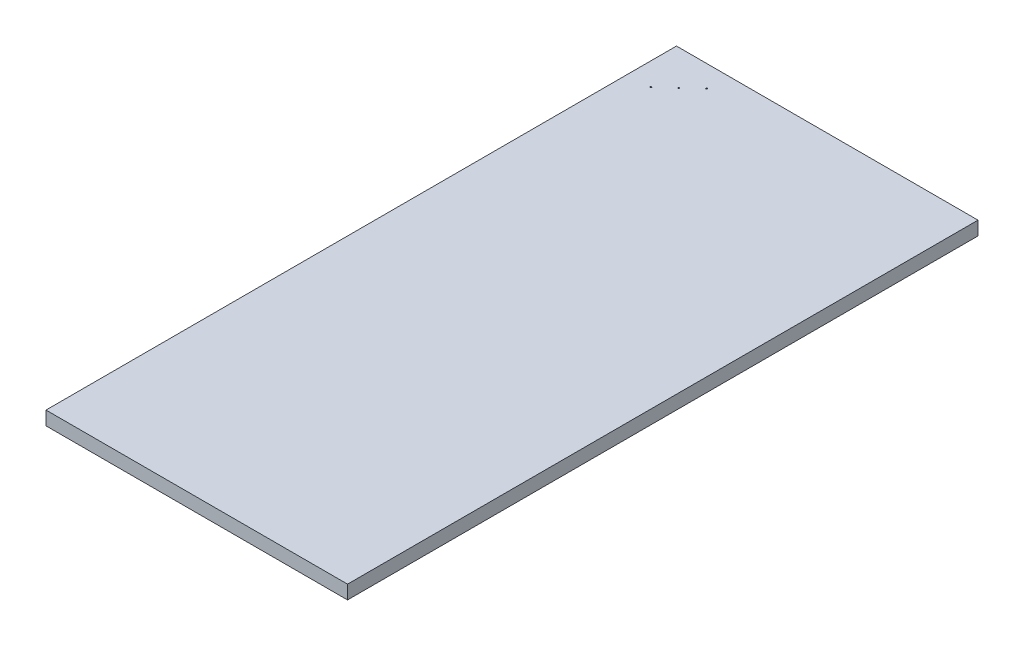
ISO-10303-21;
HEADER;
FILE_DESCRIPTION(('STEP AP214'),'2;1');
FILE_NAME('part.step','',(''),(''),'','','');
FILE_SCHEMA(('AUTOMOTIVE_DESIGN { 1 0 10303 214 1 1 1 1 }'));
ENDSEC;
DATA;
#1=APPLICATION_CONTEXT('core data for automotive mechanical design processes');
#2=APPLICATION_PROTOCOL_DEFINITION('international standard','automotive_design',2000,#1);
#3=PRODUCT_CONTEXT('',#1,'mechanical');
#4=PRODUCT('Part','Part','',(#3));
#5=PRODUCT_RELATED_PRODUCT_CATEGORY('part','',(#4));
#6=PRODUCT_DEFINITION_FORMATION('','',#4);
#7=PRODUCT_DEFINITION_CONTEXT('part definition',#1,'design');
#8=PRODUCT_DEFINITION('design','',#6,#7);
#9=PRODUCT_DEFINITION_SHAPE('','',#8);
#10=(LENGTH_UNIT() NAMED_UNIT(*) SI_UNIT(.MILLI.,.METRE.));
#11=(NAMED_UNIT(*) PLANE_ANGLE_UNIT() SI_UNIT($,.RADIAN.));
#12=(NAMED_UNIT(*) SI_UNIT($,.STERADIAN.) SOLID_ANGLE_UNIT());
#13=UNCERTAINTY_MEASURE_WITH_UNIT(LENGTH_MEASURE(1.E-05),#10,'distance_accuracy_value','');
#14=(GEOMETRIC_REPRESENTATION_CONTEXT(3) GLOBAL_UNCERTAINTY_ASSIGNED_CONTEXT((#13)) GLOBAL_UNIT_ASSIGNED_CONTEXT((#10,
#11,#12)) REPRESENTATION_CONTEXT('',''));
#15=CARTESIAN_POINT('',(0.,0.,0.));
#16=DIRECTION('',(0.,0.,1.));
#17=DIRECTION('',(1.,0.,0.));
#18=AXIS2_PLACEMENT_3D('',#15,#16,#17);
#19=CARTESIAN_POINT('',(139.7,12.7,0.));
#20=DIRECTION('',(1.,0.,0.));
#21=DIRECTION('',(0.,0.,-1.));
#22=AXIS2_PLACEMENT_3D('',#19,#20,#21);
#23=PLANE('',#22);
#24=DIRECTION('',(0.,0.,1.));
#25=VECTOR('',#24,1.);
#26=CARTESIAN_POINT('',(139.7,0.,0.));
#27=LINE('',#26,#25);
#28=CARTESIAN_POINT('',(139.7,0.,-292.1));
#29=VERTEX_POINT('',#28);
#30=CARTESIAN_POINT('',(139.7,0.,292.1));
#31=VERTEX_POINT('',#30);
#32=EDGE_CURVE('E105',#29,#31,#27,.T.);
#33=ORIENTED_EDGE('',*,*,#32,.F.);
#34=DIRECTION('',(0.,-1.,0.));
#35=VECTOR('',#34,1.);
#36=CARTESIAN_POINT('',(139.7,12.7,-292.1));
#37=LINE('',#36,#35);
#38=CARTESIAN_POINT('',(139.7,12.7,-292.1));
#39=VERTEX_POINT('',#38);
#40=EDGE_CURVE('E11',#39,#29,#37,.T.);
#41=ORIENTED_EDGE('',*,*,#40,.F.);
#42=DIRECTION('',(0.,0.,1.));
#43=VECTOR('',#42,1.);
#44=CARTESIAN_POINT('',(139.7,12.7,0.));
#45=LINE('',#44,#43);
#46=CARTESIAN_POINT('',(139.7,12.7,292.1));
#47=VERTEX_POINT('',#46);
#48=EDGE_CURVE('E98',#39,#47,#45,.T.);
#49=ORIENTED_EDGE('',*,*,#48,.T.);
#50=DIRECTION('',(0.,-1.,0.));
#51=VECTOR('',#50,1.);
#52=CARTESIAN_POINT('',(139.7,12.7,292.1));
#53=LINE('',#52,#51);
#54=EDGE_CURVE('E79',#47,#31,#53,.T.);
#55=ORIENTED_EDGE('',*,*,#54,.T.);
#56=EDGE_LOOP('',(#33,#41,#49,#55));
#57=FACE_BOUND('',#56,.T.);
#58=ADVANCED_FACE('F41',(#57),#23,.T.);
#59=CARTESIAN_POINT('',(0.,12.7,-292.1));
#60=DIRECTION('',(0.,0.,-1.));
#61=DIRECTION('',(-1.,0.,0.));
#62=AXIS2_PLACEMENT_3D('',#59,#60,#61);
#63=PLANE('',#62);
#64=DIRECTION('',(1.,0.,0.));
#65=VECTOR('',#64,1.);
#66=CARTESIAN_POINT('',(0.,0.,-292.1));
#67=LINE('',#66,#65);
#68=CARTESIAN_POINT('',(-139.7,0.,-292.1));
#69=VERTEX_POINT('',#68);
#70=EDGE_CURVE('E92',#69,#29,#67,.T.);
#71=ORIENTED_EDGE('',*,*,#70,.F.);
#72=DIRECTION('',(0.,-1.,0.));
#73=VECTOR('',#72,1.);
#74=CARTESIAN_POINT('',(-139.7,12.7,-292.1));
#75=LINE('',#74,#73);
#76=CARTESIAN_POINT('',(-139.7,12.7,-292.1));
#77=VERTEX_POINT('',#76);
#78=EDGE_CURVE('E49',#77,#69,#75,.T.);
#79=ORIENTED_EDGE('',*,*,#78,.F.);
#80=DIRECTION('',(1.,0.,0.));
#81=VECTOR('',#80,1.);
#82=CARTESIAN_POINT('',(0.,12.7,-292.1));
#83=LINE('',#82,#81);
#84=EDGE_CURVE('E90',#77,#39,#83,.T.);
#85=ORIENTED_EDGE('',*,*,#84,.T.);
#86=ORIENTED_EDGE('',*,*,#40,.T.);
#87=EDGE_LOOP('',(#71,#79,#85,#86));
#88=FACE_BOUND('',#87,.T.);
#89=ADVANCED_FACE('F88',(#88),#63,.T.);
#90=CARTESIAN_POINT('',(-139.7,12.7,0.));
#91=DIRECTION('',(1.,0.,0.));
#92=DIRECTION('',(0.,0.,-1.));
#93=AXIS2_PLACEMENT_3D('',#90,#91,#92);
#94=PLANE('',#93);
#95=DIRECTION('',(0.,0.,1.));
#96=VECTOR('',#95,1.);
#97=CARTESIAN_POINT('',(-139.7,0.,0.));
#98=LINE('',#97,#96);
#99=CARTESIAN_POINT('',(-139.7,0.,292.1));
#100=VERTEX_POINT('',#99);
#101=EDGE_CURVE('E72',#69,#100,#98,.T.);
#102=ORIENTED_EDGE('',*,*,#101,.T.);
#103=DIRECTION('',(0.,-1.,0.));
#104=VECTOR('',#103,1.);
#105=CARTESIAN_POINT('',(-139.7,12.7,292.1));
#106=LINE('',#105,#104);
#107=CARTESIAN_POINT('',(-139.7,12.7,292.1));
#108=VERTEX_POINT('',#107);
#109=EDGE_CURVE('E93',#108,#100,#106,.T.);
#110=ORIENTED_EDGE('',*,*,#109,.F.);
#111=DIRECTION('',(0.,0.,1.));
#112=VECTOR('',#111,1.);
#113=CARTESIAN_POINT('',(-139.7,12.7,0.));
#114=LINE('',#113,#112);
#115=EDGE_CURVE('E94',#77,#108,#114,.T.);
#116=ORIENTED_EDGE('',*,*,#115,.F.);
#117=ORIENTED_EDGE('',*,*,#78,.T.);
#118=EDGE_LOOP('',(#102,#110,#116,#117));
#119=FACE_BOUND('',#118,.T.);
#120=ADVANCED_FACE('F95',(#119),#94,.F.);
#121=CARTESIAN_POINT('',(0.,12.7,292.1));
#122=DIRECTION('',(0.,0.,-1.));
#123=DIRECTION('',(-1.,0.,0.));
#124=AXIS2_PLACEMENT_3D('',#121,#122,#123);
#125=PLANE('',#124);
#126=DIRECTION('',(1.,0.,0.));
#127=VECTOR('',#126,1.);
#128=CARTESIAN_POINT('',(0.,0.,292.1));
#129=LINE('',#128,#127);
#130=EDGE_CURVE('E100',#100,#31,#129,.T.);
#131=ORIENTED_EDGE('',*,*,#130,.T.);
#132=ORIENTED_EDGE('',*,*,#54,.F.);
#133=DIRECTION('',(1.,0.,0.));
#134=VECTOR('',#133,1.);
#135=CARTESIAN_POINT('',(0.,12.7,292.1));
#136=LINE('',#135,#134);
#137=EDGE_CURVE('E57',#108,#47,#136,.T.);
#138=ORIENTED_EDGE('',*,*,#137,.F.);
#139=ORIENTED_EDGE('',*,*,#109,.T.);
#140=EDGE_LOOP('',(#131,#132,#138,#139));
#141=FACE_BOUND('',#140,.T.);
#142=ADVANCED_FACE('F115',(#141),#125,.F.);
#143=CARTESIAN_POINT('',(0.,12.7,0.));
#144=DIRECTION('',(0.,1.,0.));
#145=DIRECTION('',(0.,0.,1.));
#146=AXIS2_PLACEMENT_3D('',#143,#144,#145);
#147=PLANE('',#146);
#148=CARTESIAN_POINT('',(-118.589799828785,12.7,-247.27711409136));
#149=DIRECTION('',(0.,1.,0.));
#150=DIRECTION('',(0.,0.,1.));
#151=AXIS2_PLACEMENT_3D('',#148,#149,#150);
#152=CIRCLE('',#151,0.634999999999985);
#153=CARTESIAN_POINT('',(-118.589799828785,12.7,-246.64211409136));
#154=VERTEX_POINT('',#153);
#155=EDGE_CURVE('E108',#154,#154,#152,.T.);
#156=ORIENTED_EDGE('',*,*,#155,.F.);
#157=EDGE_LOOP('',(#156));
#158=FACE_BOUND('',#157,.T.);
#159=CARTESIAN_POINT('',(-105.02854599514,12.7,-259.508833235432));
#160=DIRECTION('',(0.,1.,0.));
#161=DIRECTION('',(0.,0.,1.));
#162=AXIS2_PLACEMENT_3D('',#159,#160,#161);
#163=CIRCLE('',#162,0.634999999999999);
#164=CARTESIAN_POINT('',(-105.02854599514,12.7,-258.873833235432));
#165=VERTEX_POINT('',#164);
#166=EDGE_CURVE('E161',#165,#165,#163,.T.);
#167=ORIENTED_EDGE('',*,*,#166,.F.);
#168=EDGE_LOOP('',(#167));
#169=FACE_BOUND('',#168,.T.);
#170=CARTESIAN_POINT('',(-91.5929203588796,12.7,-271.87841376681));
#171=DIRECTION('',(0.,1.,0.));
#172=DIRECTION('',(0.,0.,1.));
#173=AXIS2_PLACEMENT_3D('',#170,#171,#172);
#174=CIRCLE('',#173,0.634999999999999);
#175=CARTESIAN_POINT('',(-91.5929203588796,12.7,-271.24341376681));
#176=VERTEX_POINT('',#175);
#177=EDGE_CURVE('E157',#176,#176,#174,.T.);
#178=ORIENTED_EDGE('',*,*,#177,.F.);
#179=EDGE_LOOP('',(#178));
#180=FACE_BOUND('',#179,.T.);
#181=ORIENTED_EDGE('',*,*,#48,.F.);
#182=ORIENTED_EDGE('',*,*,#84,.F.);
#183=ORIENTED_EDGE('',*,*,#115,.T.);
#184=ORIENTED_EDGE('',*,*,#137,.T.);
#185=EDGE_LOOP('',(#181,#182,#183,#184));
#186=FACE_BOUND('',#185,.T.);
#187=ADVANCED_FACE('F97',(#158,#169,#180,#186),#147,.T.);
#188=CARTESIAN_POINT('',(0.,0.,0.));
#189=DIRECTION('',(0.,1.,0.));
#190=DIRECTION('',(0.,0.,1.));
#191=AXIS2_PLACEMENT_3D('',#188,#189,#190);
#192=PLANE('',#191);
#193=CARTESIAN_POINT('',(-118.589799828785,0.,-247.27711409136));
#194=DIRECTION('',(0.,1.,0.));
#195=DIRECTION('',(0.,0.,1.));
#196=AXIS2_PLACEMENT_3D('',#193,#194,#195);
#197=CIRCLE('',#196,0.634999999999985);
#198=CARTESIAN_POINT('',(-118.589799828785,0.,-246.64211409136));
#199=VERTEX_POINT('',#198);
#200=EDGE_CURVE('E156',#199,#199,#197,.T.);
#201=ORIENTED_EDGE('',*,*,#200,.T.);
#202=EDGE_LOOP('',(#201));
#203=FACE_BOUND('',#202,.T.);
#204=CARTESIAN_POINT('',(-105.02854599514,0.,-259.508833235432));
#205=DIRECTION('',(0.,1.,0.));
#206=DIRECTION('',(0.,0.,1.));
#207=AXIS2_PLACEMENT_3D('',#204,#205,#206);
#208=CIRCLE('',#207,0.634999999999999);
#209=CARTESIAN_POINT('',(-105.02854599514,0.,-258.873833235432));
#210=VERTEX_POINT('',#209);
#211=EDGE_CURVE('E158',#210,#210,#208,.T.);
#212=ORIENTED_EDGE('',*,*,#211,.T.);
#213=EDGE_LOOP('',(#212));
#214=FACE_BOUND('',#213,.T.);
#215=CARTESIAN_POINT('',(-91.5929203588796,0.,-271.87841376681));
#216=DIRECTION('',(0.,1.,0.));
#217=DIRECTION('',(0.,0.,1.));
#218=AXIS2_PLACEMENT_3D('',#215,#216,#217);
#219=CIRCLE('',#218,0.634999999999999);
#220=CARTESIAN_POINT('',(-91.5929203588796,0.,-271.24341376681));
#221=VERTEX_POINT('',#220);
#222=EDGE_CURVE('E164',#221,#221,#219,.T.);
#223=ORIENTED_EDGE('',*,*,#222,.T.);
#224=EDGE_LOOP('',(#223));
#225=FACE_BOUND('',#224,.T.);
#226=ORIENTED_EDGE('',*,*,#32,.T.);
#227=ORIENTED_EDGE('',*,*,#130,.F.);
#228=ORIENTED_EDGE('',*,*,#101,.F.);
#229=ORIENTED_EDGE('',*,*,#70,.T.);
#230=EDGE_LOOP('',(#226,#227,#228,#229));
#231=FACE_BOUND('',#230,.T.);
#232=ADVANCED_FACE('F117',(#203,#214,#225,#231),#192,.F.);
#233=CARTESIAN_POINT('',(-91.5929203588796,0.,-271.87841376681));
#234=DIRECTION('',(0.,1.,0.));
#235=DIRECTION('',(0.,0.,1.));
#236=AXIS2_PLACEMENT_3D('',#233,#234,#235);
#237=CYLINDRICAL_SURFACE('',#236,0.634999999999999);
#238=ORIENTED_EDGE('',*,*,#177,.T.);
#239=EDGE_LOOP('',(#238));
#240=FACE_BOUND('',#239,.T.);
#241=ORIENTED_EDGE('',*,*,#222,.F.);
#242=EDGE_LOOP('',(#241));
#243=FACE_BOUND('',#242,.T.);
#244=ADVANCED_FACE('F133',(#240,#243),#237,.F.);
#245=CARTESIAN_POINT('',(-105.02854599514,0.,-259.508833235432));
#246=DIRECTION('',(0.,1.,0.));
#247=DIRECTION('',(0.,0.,1.));
#248=AXIS2_PLACEMENT_3D('',#245,#246,#247);
#249=CYLINDRICAL_SURFACE('',#248,0.634999999999999);
#250=ORIENTED_EDGE('',*,*,#166,.T.);
#251=EDGE_LOOP('',(#250));
#252=FACE_BOUND('',#251,.T.);
#253=ORIENTED_EDGE('',*,*,#211,.F.);
#254=EDGE_LOOP('',(#253));
#255=FACE_BOUND('',#254,.T.);
#256=ADVANCED_FACE('F140',(#252,#255),#249,.F.);
#257=CARTESIAN_POINT('',(-118.589799828785,0.,-247.27711409136));
#258=DIRECTION('',(0.,1.,0.));
#259=DIRECTION('',(0.,0.,1.));
#260=AXIS2_PLACEMENT_3D('',#257,#258,#259);
#261=CYLINDRICAL_SURFACE('',#260,0.634999999999985);
#262=ORIENTED_EDGE('',*,*,#155,.T.);
#263=EDGE_LOOP('',(#262));
#264=FACE_BOUND('',#263,.T.);
#265=ORIENTED_EDGE('',*,*,#200,.F.);
#266=EDGE_LOOP('',(#265));
#267=FACE_BOUND('',#266,.T.);
#268=ADVANCED_FACE('F144',(#264,#267),#261,.F.);
#269=CLOSED_SHELL('',(#58,#89,#120,#142,#187,#232,#244,#256,#268));
#270=MANIFOLD_SOLID_BREP('B2',#269);
#271=ADVANCED_BREP_SHAPE_REPRESENTATION('',(#18,#270),#14);
#272=SHAPE_DEFINITION_REPRESENTATION(#9,#271);
ENDSEC;
END-ISO-10303-21;
